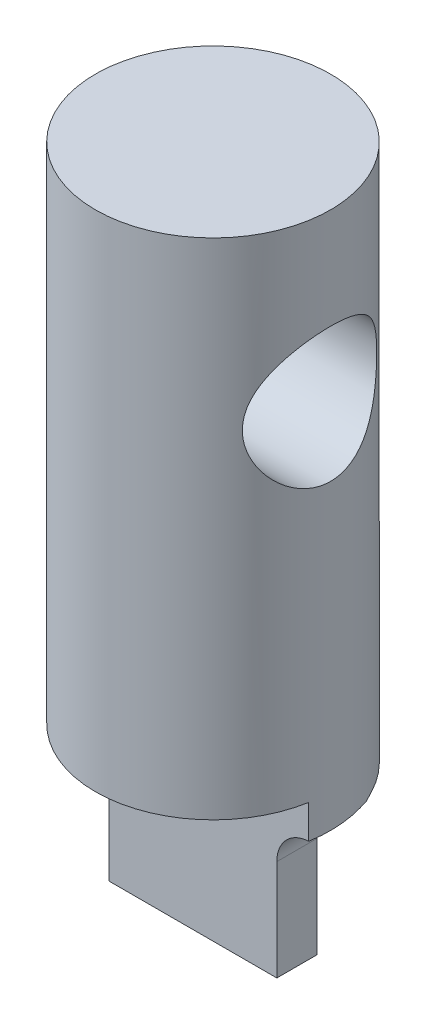
ISO-10303-21;
HEADER;
FILE_DESCRIPTION(('STEP AP214'),'2;1');
FILE_NAME('part.step','',(''),(''),'','','');
FILE_SCHEMA(('AUTOMOTIVE_DESIGN { 1 0 10303 214 1 1 1 1 }'));
ENDSEC;
DATA;
#1=APPLICATION_CONTEXT('core data for automotive mechanical design processes');
#2=APPLICATION_PROTOCOL_DEFINITION('international standard','automotive_design',2000,#1);
#3=PRODUCT_CONTEXT('',#1,'mechanical');
#4=PRODUCT('Part','Part','',(#3));
#5=PRODUCT_RELATED_PRODUCT_CATEGORY('part','',(#4));
#6=PRODUCT_DEFINITION_FORMATION('','',#4);
#7=PRODUCT_DEFINITION_CONTEXT('part definition',#1,'design');
#8=PRODUCT_DEFINITION('design','',#6,#7);
#9=PRODUCT_DEFINITION_SHAPE('','',#8);
#10=(LENGTH_UNIT() NAMED_UNIT(*) SI_UNIT(.MILLI.,.METRE.));
#11=(NAMED_UNIT(*) PLANE_ANGLE_UNIT() SI_UNIT($,.RADIAN.));
#12=(NAMED_UNIT(*) SI_UNIT($,.STERADIAN.) SOLID_ANGLE_UNIT());
#13=UNCERTAINTY_MEASURE_WITH_UNIT(LENGTH_MEASURE(1.E-05),#10,'distance_accuracy_value','');
#14=(GEOMETRIC_REPRESENTATION_CONTEXT(3) GLOBAL_UNCERTAINTY_ASSIGNED_CONTEXT((#13)) GLOBAL_UNIT_ASSIGNED_CONTEXT((#10,
#11,#12)) REPRESENTATION_CONTEXT('',''));
#15=CARTESIAN_POINT('',(0.,0.,0.));
#16=DIRECTION('',(0.,0.,1.));
#17=DIRECTION('',(1.,0.,0.));
#18=AXIS2_PLACEMENT_3D('',#15,#16,#17);
#19=CARTESIAN_POINT('',(0.,20.,0.));
#20=DIRECTION('',(0.,1.,0.));
#21=DIRECTION('',(0.,0.,1.));
#22=AXIS2_PLACEMENT_3D('',#19,#20,#21);
#23=CYLINDRICAL_SURFACE('',#22,17.5);
#24=CARTESIAN_POINT('',(17.5,85.,0.));
#25=CARTESIAN_POINT('',(17.4999979868255,84.9999977806547,0.257935712475636));
#26=CARTESIAN_POINT('',(17.4942823940968,84.9900046194406,0.515951338248237));
#27=CARTESIAN_POINT('',(17.4715560704947,84.9501523388648,1.0300566002893));
#28=CARTESIAN_POINT('',(17.454538277903,84.9202807992864,1.28614493113263));
#29=CARTESIAN_POINT('',(17.4095881860535,84.8409771085639,1.79487538192351));
#30=CARTESIAN_POINT('',(17.3816323703243,84.7915028090595,2.04750885462536));
#31=CARTESIAN_POINT('',(17.3154981674919,84.6736164445406,2.54695873651591));
#32=CARTESIAN_POINT('',(17.2773188162456,84.6052025933877,2.79377459467753));
#33=CARTESIAN_POINT('',(17.1918577616143,84.450613686155,3.27877572809726));
#34=CARTESIAN_POINT('',(17.144621475626,84.3645271065117,3.51699730104857));
#35=CARTESIAN_POINT('',(17.0419860913522,84.1752716232026,3.98472670495858));
#36=CARTESIAN_POINT('',(16.9865867222853,84.072102152858,4.21423424654229));
#37=CARTESIAN_POINT('',(16.868840115135,83.8496702576019,4.66326955139893));
#38=CARTESIAN_POINT('',(16.8064968295679,83.7304169796137,4.88280289285636));
#39=CARTESIAN_POINT('',(16.6760808290629,83.4766457176227,5.31116558590711));
#40=CARTESIAN_POINT('',(16.6080061516022,83.342122499406,5.51999123130319));
#41=CARTESIAN_POINT('',(16.4624214775571,83.048523075978,5.94068301449753));
#42=CARTESIAN_POINT('',(16.3845849809269,82.88837724373,6.15168976883497));
#43=CARTESIAN_POINT('',(16.2255446000953,82.5524955067285,6.55970074227494));
#44=CARTESIAN_POINT('',(16.1443392259096,82.3767526637387,6.75669865873048));
#45=CARTESIAN_POINT('',(15.9802883044577,82.0104532494262,7.13604426947621));
#46=CARTESIAN_POINT('',(15.8974413271866,81.8198832975537,7.3183784217174));
#47=CARTESIAN_POINT('',(15.7320326353485,81.4248750296747,7.66749415393978));
#48=CARTESIAN_POINT('',(15.6494709297596,81.2204362812892,7.83427524864763));
#49=CARTESIAN_POINT('',(15.477703535529,80.7754563318141,8.16883023298701));
#50=CARTESIAN_POINT('',(15.3887526871419,80.5334075015613,8.33473667294528));
#51=CARTESIAN_POINT('',(15.2163760585006,80.0341799965284,8.64543100792296));
#52=CARTESIAN_POINT('',(15.1329510640381,79.7769991797148,8.79021590290503));
#53=CARTESIAN_POINT('',(14.9746807796734,79.2490462074714,9.0572070153137));
#54=CARTESIAN_POINT('',(14.8998250091883,78.9782912498041,9.17944092812885));
#55=CARTESIAN_POINT('',(14.7616074345714,78.4244497741898,9.4001022679361));
#56=CARTESIAN_POINT('',(14.6982418613251,78.1413673379349,9.49853750512095));
#57=CARTESIAN_POINT('',(14.5983423427393,77.6287055280102,9.65115372904453));
#58=CARTESIAN_POINT('',(14.5589737816985,77.401148193056,9.71030743190504));
#59=CARTESIAN_POINT('',(14.4901968197609,76.9410071037895,9.81264540287861));
#60=CARTESIAN_POINT('',(14.4607864301503,76.7084243629662,9.85583285971697));
#61=CARTESIAN_POINT('',(14.4129467127035,76.2398744114409,9.92566188622712));
#62=CARTESIAN_POINT('',(14.3945076446673,76.0039103937924,9.95231813298911));
#63=CARTESIAN_POINT('',(14.3692375602479,75.5300512075554,9.98876914442462));
#64=CARTESIAN_POINT('',(14.362406775435,75.2921560005371,9.99856357272649));
#65=CARTESIAN_POINT('',(14.3606097259068,74.8159043494184,10.001144501773));
#66=CARTESIAN_POINT('',(14.3656596011975,74.5775477179156,9.99390786562675));
#67=CARTESIAN_POINT('',(14.3874667242791,74.1025002097456,9.96248776401509));
#68=CARTESIAN_POINT('',(14.4042240183591,73.8658093396683,9.93830423154453));
#69=CARTESIAN_POINT('',(14.4488449764179,73.3956526468184,9.87331886132434));
#70=CARTESIAN_POINT('',(14.4767151160874,73.1621887867094,9.83250733378678));
#71=CARTESIAN_POINT('',(14.5425965699819,72.7001245734982,9.73480084264666));
#72=CARTESIAN_POINT('',(14.5806081275568,72.471524337244,9.67790549310067));
#73=CARTESIAN_POINT('',(14.6653837056209,72.0213857695125,9.54894973269151));
#74=CARTESIAN_POINT('',(14.712110458863,71.7998219033615,9.47695373657523));
#75=CARTESIAN_POINT('',(14.8130846815472,71.3637208193821,9.31833428783118));
#76=CARTESIAN_POINT('',(14.8673347354085,71.1491860476455,9.23170580638368));
#77=CARTESIAN_POINT('',(15.0392492979227,70.5174659690542,8.95093131299783));
#78=CARTESIAN_POINT('',(15.1661231060327,70.1119393619861,8.73583079291443));
#79=CARTESIAN_POINT('',(15.4546711926498,69.2750229500435,8.21612488323257));
#80=CARTESIAN_POINT('',(15.6186641110564,68.8499026612341,7.90270010447165));
#81=CARTESIAN_POINT('',(15.8660772642798,68.253515886083,7.38608766540814));
#82=CARTESIAN_POINT('',(15.9488477258696,68.0614750951189,7.20598629951527));
#83=CARTESIAN_POINT('',(16.1130920084403,67.6918417985275,6.83082318334465));
#84=CARTESIAN_POINT('',(16.1945656177635,67.5142516323105,6.63575902063181));
#85=CARTESIAN_POINT('',(16.3635383796171,67.1550461535497,6.20832453422435));
#86=CARTESIAN_POINT('',(16.4506617686405,66.9752911005536,5.97423857173732));
#87=CARTESIAN_POINT('',(16.6186465162681,66.636324279654,5.48965472766126));
#88=CARTESIAN_POINT('',(16.6995103987039,66.4771042146166,5.23916353665728));
#89=CARTESIAN_POINT('',(16.8527441092134,66.1806415322799,4.72307604325323));
#90=CARTESIAN_POINT('',(16.9251157571672,66.0433942039326,4.45748299534881));
#91=CARTESIAN_POINT('',(17.0592582821866,65.7924190858084,3.91284084323328));
#92=CARTESIAN_POINT('',(17.1210304736491,65.6786883794685,3.63379341295261));
#93=CARTESIAN_POINT('',(17.2282281061223,65.4832756298085,3.08400643489189));
#94=CARTESIAN_POINT('',(17.2744877593832,65.3999228980344,2.81402367137461));
#95=CARTESIAN_POINT('',(17.3548466440517,65.2560650769391,2.26625179135742));
#96=CARTESIAN_POINT('',(17.3889463179324,65.1955591562713,1.98846295929888));
#97=CARTESIAN_POINT('',(17.4439389870897,65.0983529856142,1.42769004995767));
#98=CARTESIAN_POINT('',(17.4648428266057,65.0616331877137,1.14471043575959));
#99=CARTESIAN_POINT('',(17.4928348330458,65.0125236091901,0.575979150248226));
#100=CARTESIAN_POINT('',(17.4999245464831,65.0001311050869,0.29022779283598));
#101=CARTESIAN_POINT('',(17.5000652083574,64.9998867099822,-0.246547559789149));
#102=CARTESIAN_POINT('',(17.4947162116065,65.0092378150911,-0.497575398795089));
#103=CARTESIAN_POINT('',(17.4733266127457,65.0467400488142,-0.997744312031972));
#104=CARTESIAN_POINT('',(17.4572870564109,65.0748893385478,-1.24688556840204));
#105=CARTESIAN_POINT('',(17.4149031130774,65.149629701252,-1.74148402033753));
#106=CARTESIAN_POINT('',(17.3885587853426,65.1962206681627,-1.98694123708183));
#107=CARTESIAN_POINT('',(17.3261821915081,65.3072862859166,-2.47251600687362));
#108=CARTESIAN_POINT('',(17.2901496323308,65.3717614777757,-2.71263339814865));
#109=CARTESIAN_POINT('',(17.2096359442408,65.5171107349749,-3.18353496562945));
#110=CARTESIAN_POINT('',(17.1652479507959,65.5978046303304,-3.4143908781331));
#111=CARTESIAN_POINT('',(17.0686990105672,65.7752491746352,-3.86825118766334));
#112=CARTESIAN_POINT('',(17.0165353164057,65.8720055002802,-4.09125277496241));
#113=CARTESIAN_POINT('',(16.9055021620532,66.0807058758467,-4.52822362056264));
#114=CARTESIAN_POINT('',(16.8466340906442,66.1926467812642,-4.74219473694522));
#115=CARTESIAN_POINT('',(16.7232867272426,66.4309443918473,-5.16035121316149));
#116=CARTESIAN_POINT('',(16.6588054152814,66.5573062916503,-5.36453300890037));
#117=CARTESIAN_POINT('',(16.5185098823631,66.8374416956853,-5.78294300635533));
#118=CARTESIAN_POINT('',(16.4422138637069,66.9926989342183,-5.99601710808323));
#119=CARTESIAN_POINT('',(16.2858700875011,67.3188505648056,-6.40851919530944));
#120=CARTESIAN_POINT('',(16.2058206395343,67.4897520361355,-6.60794093082768));
#121=CARTESIAN_POINT('',(16.0436525094802,67.8463972278207,-6.99248118179562));
#122=CARTESIAN_POINT('',(15.961532092253,68.0321536976337,-7.17758713668908));
#123=CARTESIAN_POINT('',(15.797088150234,68.4175710392385,-7.53261477539148));
#124=CARTESIAN_POINT('',(15.7147646174194,68.6172324690314,-7.7025358492111));
#125=CARTESIAN_POINT('',(15.542691494459,69.0527630209848,-8.0445859738455));
#126=CARTESIAN_POINT('',(15.4531392137275,69.2901856501746,-8.21484268320355));
#127=CARTESIAN_POINT('',(15.2788309152998,69.7803135375681,-8.53466513032912));
#128=CARTESIAN_POINT('',(15.1940755859622,70.0330209784204,-8.68422790296005));
#129=CARTESIAN_POINT('',(15.032342741009,70.5522902337263,-8.96127110203343));
#130=CARTESIAN_POINT('',(14.955356941844,70.8188368241255,-9.08877515244744));
#131=CARTESIAN_POINT('',(14.8120530436713,71.3645976070458,-9.32049704240887));
#132=CARTESIAN_POINT('',(14.7457316682584,71.6438078750076,-9.42472203776731));
#133=CARTESIAN_POINT('',(14.6393800853736,72.1522978564172,-9.58884562434214));
#134=CARTESIAN_POINT('',(14.5967594105274,72.3795237834309,-9.65345712287691));
#135=CARTESIAN_POINT('',(14.5212384075228,72.8394933757716,-9.76669228660932));
#136=CARTESIAN_POINT('',(14.4883361324869,73.0722359258534,-9.81531915421291));
#137=CARTESIAN_POINT('',(14.4333839780158,73.5416314394956,-9.89594934469037));
#138=CARTESIAN_POINT('',(14.4113239132863,73.7782805163311,-9.92796827082279));
#139=CARTESIAN_POINT('',(14.3788071767777,74.254069066164,-9.97500517121269));
#140=CARTESIAN_POINT('',(14.3683506843277,74.4932085775926,-9.99002288272247));
#141=CARTESIAN_POINT('',(14.3594284808409,74.9726603684899,-10.002843451218));
#142=CARTESIAN_POINT('',(14.3609870961808,75.2129740422293,-10.0006113834313));
#143=CARTESIAN_POINT('',(14.3760929173373,75.6924361882737,-9.97888391336079));
#144=CARTESIAN_POINT('',(14.3896401674682,75.9315846562685,-9.95938844726523));
#145=CARTESIAN_POINT('',(14.4282238946407,76.4070664788909,-9.90340870948359));
#146=CARTESIAN_POINT('',(14.4532665756506,76.6433982426208,-9.86691526400265));
#147=CARTESIAN_POINT('',(14.5139460312704,77.1115193607545,-9.7774374561138));
#148=CARTESIAN_POINT('',(14.5495829911275,77.3433086356545,-9.72445280534661));
#149=CARTESIAN_POINT('',(14.6295585028424,77.7969553394423,-9.60370550533511));
#150=CARTESIAN_POINT('',(14.6737325474651,78.0189158265655,-9.53621989683348));
#151=CARTESIAN_POINT('',(14.7698820808678,78.4561472934323,-9.38661175219194));
#152=CARTESIAN_POINT('',(14.8218602388912,78.6714159538423,-9.3044842062569));
#153=CARTESIAN_POINT('',(14.987436035345,79.3057788217927,-9.03718626104024));
#154=CARTESIAN_POINT('',(15.110718977254,79.7136655009989,-8.83103697232192));
#155=CARTESIAN_POINT('',(15.3922047922842,80.5543283256767,-8.33209861894715));
#156=CARTESIAN_POINT('',(15.5528615991746,80.9812654161028,-8.03085638880198));
#157=CARTESIAN_POINT('',(15.7967817610628,81.5819244329351,-7.53299810501225));
#158=CARTESIAN_POINT('',(15.8786395436795,81.7756487740726,-7.35923330017833));
#159=CARTESIAN_POINT('',(16.0415995913775,82.1492090867596,-6.99689199696128));
#160=CARTESIAN_POINT('',(16.1227017351745,82.3290428614468,-6.80831316513962));
#161=CARTESIAN_POINT('',(16.2923489863849,82.6954664095683,-6.39264072319441));
#162=CARTESIAN_POINT('',(16.3805589394026,82.8800958306143,-6.16367817171239));
#163=CARTESIAN_POINT('',(16.5513716096548,83.2292818635184,-5.68908312387619));
#164=CARTESIAN_POINT('',(16.6339763486566,83.3938457301545,-5.44345670269834));
#165=CARTESIAN_POINT('',(16.7913352454167,83.701517827465,-4.9367429512859));
#166=CARTESIAN_POINT('',(16.8660901685794,83.8446281505724,-4.67565713232548));
#167=CARTESIAN_POINT('',(17.0055939659873,84.1078364743017,-4.13961449822452));
#168=CARTESIAN_POINT('',(17.0703455960059,84.227940814959,-3.86466153108379));
#169=CARTESIAN_POINT('',(17.1774365898285,84.4244276678306,-3.35281738556435));
#170=CARTESIAN_POINT('',(17.2217138747987,84.5047870766266,-3.11785055824598));
#171=CARTESIAN_POINT('',(17.3012266461431,84.6481088456461,-2.64119257414697));
#172=CARTESIAN_POINT('',(17.3364637315297,84.711074282632,-2.39950261493485));
#173=CARTESIAN_POINT('',(17.397023949342,84.8187789296656,-1.91151047112828));
#174=CARTESIAN_POINT('',(17.4223712781558,84.8635626343764,-1.66522110790907));
#175=CARTESIAN_POINT('',(17.462666418354,84.9345649305685,-1.16923562660988));
#176=CARTESIAN_POINT('',(17.4776201461088,84.9607940840456,-0.919541529290495));
#177=CARTESIAN_POINT('',(17.4914638950011,84.9850556710816,-0.557783649106459));
#178=CARTESIAN_POINT('',(17.4946628042429,84.9906574535729,-0.44633611313507));
#179=CARTESIAN_POINT('',(17.498931404094,84.9981302940031,-0.223264053117576));
#180=CARTESIAN_POINT('',(17.5000008713404,85.0000009605751,-0.111639511733758));
#181=CARTESIAN_POINT('',(17.5,85.,0.));
#182=B_SPLINE_CURVE_WITH_KNOTS('',3,(#24,#25,#26,#27,#28,#29,#30,#31,#32,#33,#34,#35,#36,#37,
#38,#39,#40,#41,#42,#43,#44,#45,#46,#47,#48,#49,#50,#51,#52,#53,#54,#55,#56,#57,#58,#59,#60,#61,
#62,#63,#64,#65,#66,#67,#68,#69,#70,#71,#72,#73,#74,#75,#76,#77,#78,#79,#80,#81,#82,#83,#84,#85,
#86,#87,#88,#89,#90,#91,#92,#93,#94,#95,#96,#97,#98,#99,#100,#101,#102,#103,#104,#105,#106,#107,
#108,#109,#110,#111,#112,#113,#114,#115,#116,#117,#118,#119,#120,#121,#122,#123,#124,#125,#126,
#127,#128,#129,#130,#131,#132,#133,#134,#135,#136,#137,#138,#139,#140,#141,#142,#143,#144,#145,
#146,#147,#148,#149,#150,#151,#152,#153,#154,#155,#156,#157,#158,#159,#160,#161,#162,#163,#164,
#165,#166,#167,#168,#169,#170,#171,#172,#173,#174,#175,#176,#177,#178,#179,#180,#181),
.UNSPECIFIED.,.T.,.F.,(4,2,2,2,2,2,2,2,2,2,2,2,2,2,2,2,2,2,2,2,2,2,2,2,2,2,2,2,2,2,2,2,2,2,2,2,
2,2,2,2,2,2,2,2,2,2,2,2,2,2,2,2,2,2,2,2,2,2,2,2,2,2,2,2,2,2,2,2,2,2,2,2,2,2,2,2,2,2,4),(0.,
0.773690810059207,1.5478654845956,2.32371384289975,3.09963539432407,3.87176318506903,
4.64391659419774,5.41563271393325,6.18761416509908,7.01505666148934,7.84286910354637,
8.67143745885687,9.50003165781306,10.4188051765691,11.3377090682101,12.2554768087965,
13.1729429484643,13.8873907663071,14.601695819838,15.3153657725343,16.0290499618667,
16.7437042586717,17.4583613811125,18.1734355594276,18.8885268979439,19.6006277514276,
20.3129738359954,21.7369557635231,23.3891327768375,24.2164532980279,25.0439074886907,
25.9659444178928,26.8876076243463,27.8090729568853,28.7304239394265,29.5881564714937,
30.4458577895045,31.3028533341447,32.1597529312667,32.9126084534985,33.6653903404896,
34.4181678982141,35.1709682306988,35.9158271292594,36.6609498343603,37.4059184703619,
38.151156306226,38.9736800248734,39.7965778067163,40.6201895892654,41.443834442127,
42.3594547561286,43.2752061294839,44.1899706171586,45.1044535247476,45.8238669858532,
46.5431362296747,47.2617284862017,47.9803318481637,48.7003905112968,49.4204518360379,
50.140902228347,50.8613652188995,51.5691248843009,52.2771271787718,53.6923953278759,
55.3255949952952,56.1434108027377,56.9613556881255,57.8814354816136,58.8011816240783,
59.7208380023057,60.640240573983,61.3961780963896,62.1519818177527,62.9059246088702,
63.6594378793675,63.9942709461532,64.3291391326439),.UNSPECIFIED.);
#183=CARTESIAN_POINT('',(17.5,85.,0.));
#184=VERTEX_POINT('',#183);
#185=EDGE_CURVE('E13',#184,#184,#182,.T.);
#186=ORIENTED_EDGE('',*,*,#185,.F.);
#187=EDGE_LOOP('',(#186));
#188=FACE_BOUND('',#187,.T.);
#189=CARTESIAN_POINT('',(-14.3614066163451,75.,9.99999999999998));
#190=CARTESIAN_POINT('',(-14.3614077608894,75.2544150778964,9.99999919069356));
#191=CARTESIAN_POINT('',(-14.3681922719696,75.5088415935461,9.99027614949745));
#192=CARTESIAN_POINT('',(-14.3950423523035,76.0155159825121,9.95154758812697));
#193=CARTESIAN_POINT('',(-14.415108832493,76.2677637051951,9.9225407453842));
#194=CARTESIAN_POINT('',(-14.4677146656621,76.7682687890077,9.84567886986767));
#195=CARTESIAN_POINT('',(-14.5002653124784,77.0165223242806,9.79780676950381));
#196=CARTESIAN_POINT('',(-14.5765752445555,77.5070444956747,9.68391141001014));
#197=CARTESIAN_POINT('',(-14.6203347003789,77.7493130406617,9.61788787467186));
#198=CARTESIAN_POINT('',(-14.7171872327601,78.2248141336555,9.46901358628469));
#199=CARTESIAN_POINT('',(-14.770214911942,78.4580968691713,9.38628014221345));
#200=CARTESIAN_POINT('',(-14.8841534872825,78.9162888805885,9.20453573141224));
#201=CARTESIAN_POINT('',(-14.9450674947102,79.1411948063852,9.10551833624238));
#202=CARTESIAN_POINT('',(-15.1370442315329,79.8018325165531,8.78531736753681));
#203=CARTESIAN_POINT('',(-15.2774091100172,80.2237961753715,8.54088602881865));
#204=CARTESIAN_POINT('',(-15.5856817333625,81.0692168531832,7.96580072474524));
#205=CARTESIAN_POINT('',(-15.754921507378,81.4877524958655,7.62862705436988));
#206=CARTESIAN_POINT('',(-16.0069975072251,82.071396219298,7.0758266986282));
#207=CARTESIAN_POINT('',(-16.0907907826785,82.2587141135651,6.88355010578419));
#208=CARTESIAN_POINT('',(-16.2559061769366,82.6177372165059,6.48399252010687));
#209=CARTESIAN_POINT('',(-16.3372291502715,82.7894478659675,6.27671680167737));
#210=CARTESIAN_POINT('',(-16.5031207260465,83.1318826530205,5.82749300882114));
#211=CARTESIAN_POINT('',(-16.5872602103054,83.3009537134546,5.58412309411241));
#212=CARTESIAN_POINT('',(-16.7480716001117,83.6178035373285,5.08150642726078));
#213=CARTESIAN_POINT('',(-16.824742907344,83.7655805952474,4.82225840574457));
#214=CARTESIAN_POINT('',(-16.9683669740937,84.0381907882567,4.28958688551924));
#215=CARTESIAN_POINT('',(-17.0353258457576,84.1630383664151,4.01617245023952));
#216=CARTESIAN_POINT('',(-17.1575464231836,84.3883096707867,3.45694510627656));
#217=CARTESIAN_POINT('',(-17.212809835191,84.4887369599834,3.17113401347699));
#218=CARTESIAN_POINT('',(-17.3055793736332,84.6559551687691,2.61518447412809));
#219=CARTESIAN_POINT('',(-17.3442232404225,84.7249344611497,2.34589342332863));
#220=CARTESIAN_POINT('',(-17.4092329510793,84.8404103416859,1.80106724064426));
#221=CARTESIAN_POINT('',(-17.4355994561433,84.8869081405862,1.52553244585411));
#222=CARTESIAN_POINT('',(-17.4752633201811,84.9566888044523,0.970796928031442));
#223=CARTESIAN_POINT('',(-17.4885697419977,84.979987768054,0.691598883586094));
#224=CARTESIAN_POINT('',(-17.5017404594881,85.0030502390967,0.131925255874034));
#225=CARTESIAN_POINT('',(-17.5016059411759,85.0028158230978,-0.148550212490261));
#226=CARTESIAN_POINT('',(-17.4886820148289,84.9801833588368,-0.676517685224887));
#227=CARTESIAN_POINT('',(-17.4773236133062,84.9602915443433,-0.924157139451819));
#228=CARTESIAN_POINT('',(-17.4443169317774,84.9022606169359,-1.41657386655287));
#229=CARTESIAN_POINT('',(-17.42266960824,84.8641232001496,-1.66135140330706));
#230=CARTESIAN_POINT('',(-17.3695878573906,84.7700607540258,-2.14638026543599));
#231=CARTESIAN_POINT('',(-17.3381531051595,84.7141351341613,-2.38663144026556));
#232=CARTESIAN_POINT('',(-17.2662028794279,84.5851252948763,-2.86108681557573));
#233=CARTESIAN_POINT('',(-17.2256870431072,84.5120403898783,-3.09529077403241));
#234=CARTESIAN_POINT('',(-17.1360628827446,84.348761774596,-3.55829068383476));
#235=CARTESIAN_POINT('',(-17.0868836483026,84.2584263107434,-3.78702279078187));
#236=CARTESIAN_POINT('',(-16.9811810955382,84.061863954148,-4.23587971533365));
#237=CARTESIAN_POINT('',(-16.9246551526388,83.955631380175,-4.4560014201761));
#238=CARTESIAN_POINT('',(-16.8054031898753,83.7281701275851,-4.88654449828843));
#239=CARTESIAN_POINT('',(-16.7426781159623,83.6069437362293,-5.09696734438377));
#240=CARTESIAN_POINT('',(-16.6121898739968,83.3502735657932,-5.5074082329513));
#241=CARTESIAN_POINT('',(-16.5444249003378,83.2148246841023,-5.70742250237706));
#242=CARTESIAN_POINT('',(-16.3972493582156,82.9144685468562,-6.11825460127685));
#243=CARTESIAN_POINT('',(-16.3173877336959,82.747961919088,-6.32774295707801));
#244=CARTESIAN_POINT('',(-16.1547638285188,82.3993357632984,-6.73209520895978));
#245=CARTESIAN_POINT('',(-16.072001332889,82.2172150767258,-6.92695801782067));
#246=CARTESIAN_POINT('',(-15.9053349411175,81.8380343063179,-7.30153328910701));
#247=CARTESIAN_POINT('',(-15.8214298369941,81.6409572093403,-7.48122799175692));
#248=CARTESIAN_POINT('',(-15.654517047834,81.2328624373881,-7.82448230550949));
#249=CARTESIAN_POINT('',(-15.5715093800881,81.021844494374,-7.98804160622717));
#250=CARTESIAN_POINT('',(-15.4002867357296,80.5648962111023,-8.31374204680292));
#251=CARTESIAN_POINT('',(-15.3123789637889,80.3175834460344,-8.47411219404252));
#252=CARTESIAN_POINT('',(-15.1429756677386,79.8080585446329,-8.77324627838107));
#253=CARTESIAN_POINT('',(-15.061481033386,79.5458443495392,-8.91200722002965));
#254=CARTESIAN_POINT('',(-14.9080345094828,79.0082109483358,-9.16638148488004));
#255=CARTESIAN_POINT('',(-14.8360688084758,78.7328116597114,-9.28202843678565));
#256=CARTESIAN_POINT('',(-14.7045975812725,78.1701566010127,-9.48893395841661));
#257=CARTESIAN_POINT('',(-14.6450877003048,77.8829050168962,-9.58020105485709));
#258=CARTESIAN_POINT('',(-14.553251905705,77.3656507039398,-9.71895529180451));
#259=CARTESIAN_POINT('',(-14.5178216129494,77.1375921252812,-9.77168164642523));
#260=CARTESIAN_POINT('',(-14.4571918965724,76.6770386382915,-9.86116308246928));
#261=CARTESIAN_POINT('',(-14.4319904668805,76.4445446092084,-9.89792129564183));
#262=CARTESIAN_POINT('',(-14.3927017861997,75.9767945921072,-9.95496556010652));
#263=CARTESIAN_POINT('',(-14.3786057143886,75.7415409470651,-9.97526468498476));
#264=CARTESIAN_POINT('',(-14.3620056681943,75.2697664367658,-9.99915038467961));
#265=CARTESIAN_POINT('',(-14.3595019892031,75.0332455393707,-10.0027365336238));
#266=CARTESIAN_POINT('',(-14.3661830056139,74.5605790767916,-9.99313858043444));
#267=CARTESIAN_POINT('',(-14.3753742789411,74.3244337977014,-9.97994504042427));
#268=CARTESIAN_POINT('',(-14.4051171321618,73.8543891511197,-9.93696521564553));
#269=CARTESIAN_POINT('',(-14.425668754265,73.6204897919762,-9.90717886922589));
#270=CARTESIAN_POINT('',(-14.4774141374652,73.1564370365846,-9.83140768977235));
#271=CARTESIAN_POINT('',(-14.5086124195691,72.9262852752909,-9.78541597500637));
#272=CARTESIAN_POINT('',(-14.5806265632807,72.4711258220958,-9.67778456882104));
#273=CARTESIAN_POINT('',(-14.6214463036466,72.2461202450452,-9.6161385658139));
#274=CARTESIAN_POINT('',(-14.7119947751798,71.7998246077606,-9.47703391214448));
#275=CARTESIAN_POINT('',(-14.7618248580549,71.5786119049954,-9.3993938049147));
#276=CARTESIAN_POINT('',(-14.8686663500159,71.1436130750627,-9.22945454301334));
#277=CARTESIAN_POINT('',(-14.9256801266721,70.929829426102,-9.13715055285522));
#278=CARTESIAN_POINT('',(-15.0454393305122,70.5104975942096,-8.93857898932572));
#279=CARTESIAN_POINT('',(-15.1081853977035,70.3049503345616,-8.83230985617061));
#280=CARTESIAN_POINT('',(-15.2379767647689,69.9027282864117,-8.6064527722627));
#281=CARTESIAN_POINT('',(-15.3050223162533,69.7060540183159,-8.48686404173099));
#282=CARTESIAN_POINT('',(-15.4534292508155,69.2901632248009,-8.21398093816703));
#283=CARTESIAN_POINT('',(-15.5353169011545,69.0726385050098,-8.05838882684503));
#284=CARTESIAN_POINT('',(-15.7009619680746,68.6511602259812,-7.73068595303427));
#285=CARTESIAN_POINT('',(-15.7847195397912,68.4472077983798,-7.55857381604681));
#286=CARTESIAN_POINT('',(-15.9521698615337,68.0535274480709,-7.19845336222198));
#287=CARTESIAN_POINT('',(-16.0358625234412,67.8638097175264,-7.01043385669449));
#288=CARTESIAN_POINT('',(-16.2012298285532,67.4995881047403,-6.61930849940368));
#289=CARTESIAN_POINT('',(-16.2829041360653,67.3250867412402,-6.41620016027507));
#290=CARTESIAN_POINT('',(-16.450398930495,66.9755710547075,-5.9745776650814));
#291=CARTESIAN_POINT('',(-16.5358137283182,66.8022604994141,-5.73455555014515));
#292=CARTESIAN_POINT('',(-16.699594610513,66.4767237583408,-5.23848562224432));
#293=CARTESIAN_POINT('',(-16.777963706055,66.3244885502821,-4.98244473544082));
#294=CARTESIAN_POINT('',(-16.9254481636678,66.0425885018712,-4.45577693835577));
#295=CARTESIAN_POINT('',(-16.9945667416227,65.9129158130727,-4.18515514316424));
#296=CARTESIAN_POINT('',(-17.12150556908,65.6776738241043,-3.63108500813105));
#297=CARTESIAN_POINT('',(-17.1793273801446,65.5721011922217,-3.34763844774893));
#298=CARTESIAN_POINT('',(-17.2776698670346,65.3941209301706,-2.79368939215357));
#299=CARTESIAN_POINT('',(-17.3192157082664,65.3197132334525,-2.52401126302992));
#300=CARTESIAN_POINT('',(-17.3900556493052,65.193534390309,-1.97781967884862));
#301=CARTESIAN_POINT('',(-17.419350330324,65.1417621700204,-1.70130654871205));
#302=CARTESIAN_POINT('',(-17.4648009202012,65.0616722598088,-1.14403907205617));
#303=CARTESIAN_POINT('',(-17.4809665076933,65.0333372918977,-0.863288005507871));
#304=CARTESIAN_POINT('',(-17.4996977325409,65.0005195981582,-0.299952862726438));
#305=CARTESIAN_POINT('',(-17.5022646940462,64.9960345499727,-0.0173689676457669));
#306=CARTESIAN_POINT('',(-17.4942265500865,65.0101062918487,0.514028254832859));
#307=CARTESIAN_POINT('',(-17.4851217572307,65.0260385193786,0.762939007105641));
#308=CARTESIAN_POINT('',(-17.4564688165651,65.0763547947358,1.25826068022008));
#309=CARTESIAN_POINT('',(-17.4369216625523,65.1107370866762,1.50467183667407));
#310=CARTESIAN_POINT('',(-17.3878444150122,65.1975303245391,1.99328008678872));
#311=CARTESIAN_POINT('',(-17.358314137146,65.2499416033681,2.23547710254824));
#312=CARTESIAN_POINT('',(-17.2899444446051,65.3721889898146,2.71408623705684));
#313=CARTESIAN_POINT('',(-17.2511046896421,65.4420257343872,2.95049814399527));
#314=CARTESIAN_POINT('',(-17.1649078836734,65.598493221829,3.4164539272666));
#315=CARTESIAN_POINT('',(-17.1175393133858,65.6851466903625,3.64598801902621));
#316=CARTESIAN_POINT('',(-17.0152925810267,65.8744028506187,4.09673675204133));
#317=CARTESIAN_POINT('',(-16.9604117463201,65.9770112203838,4.31794839655485));
#318=CARTESIAN_POINT('',(-16.844255179484,66.1972908706361,4.75092661983317));
#319=CARTESIAN_POINT('',(-16.7829805605984,66.3149595297293,4.96269483369216));
#320=CARTESIAN_POINT('',(-16.6551721331801,66.5645832458654,5.37606449421936));
#321=CARTESIAN_POINT('',(-16.5886364367544,66.6965434376402,5.57766224840815));
#322=CARTESIAN_POINT('',(-16.4440306541835,66.9891293972967,5.99140949250493));
#323=CARTESIAN_POINT('',(-16.3654953701813,67.1513118071144,6.2022967676569));
#324=CARTESIAN_POINT('',(-16.2051702349587,67.4913362737931,6.60987486940665));
#325=CARTESIAN_POINT('',(-16.1233789021057,67.6691855053782,6.80655911581463));
#326=CARTESIAN_POINT('',(-15.9582986563081,68.0397671227049,7.18507999731651));
#327=CARTESIAN_POINT('',(-15.8750084195467,68.2325132155212,7.36690263356702));
#328=CARTESIAN_POINT('',(-15.708892251868,68.6319326803771,7.714782231815));
#329=CARTESIAN_POINT('',(-15.6260663338663,68.8386064377676,7.88083875728893));
#330=CARTESIAN_POINT('',(-15.4543008511851,69.2874872574214,8.2129836854585));
#331=CARTESIAN_POINT('',(-15.3656299473578,69.5311485179234,8.37725257996231));
#332=CARTESIAN_POINT('',(-15.1940787878725,70.033536538382,8.68452347137072));
#333=CARTESIAN_POINT('',(-15.1111993585125,70.2922654384967,8.82752243686215));
#334=CARTESIAN_POINT('',(-14.9543139401747,70.8231923636221,9.09076180317971));
#335=CARTESIAN_POINT('',(-14.8802961205299,71.0953717295707,9.21103267410067));
#336=CARTESIAN_POINT('',(-14.744046982117,71.6519250282109,9.42759108750232));
#337=CARTESIAN_POINT('',(-14.6818116666092,71.9362947855158,9.52388676610586));
#338=CARTESIAN_POINT('',(-14.5846511441135,72.4485386225044,9.67180781809598));
#339=CARTESIAN_POINT('',(-14.5467368881497,72.6743619823709,9.72861332812583));
#340=CARTESIAN_POINT('',(-14.4807802305186,73.130789979386,9.82652026759994));
#341=CARTESIAN_POINT('',(-14.4527358837617,73.3613936649669,9.86762479141606));
#342=CARTESIAN_POINT('',(-14.4074779397845,73.8257888879933,9.93358875847174));
#343=CARTESIAN_POINT('',(-14.390255854573,74.0595777798397,9.95846093347162));
#344=CARTESIAN_POINT('',(-14.3672192273733,74.5289077579944,9.99166756044024));
#345=CARTESIAN_POINT('',(-14.361405556665,74.764448976752,10.0000007492989));
#346=CARTESIAN_POINT('',(-14.3614066163451,75.,9.99999999999998));
#347=B_SPLINE_CURVE_WITH_KNOTS('',3,(#189,#190,#191,#192,#193,#194,#195,#196,#197,#198,#199,
#200,#201,#202,#203,#204,#205,#206,#207,#208,#209,#210,#211,#212,#213,#214,#215,#216,#217,#218,
#219,#220,#221,#222,#223,#224,#225,#226,#227,#228,#229,#230,#231,#232,#233,#234,#235,#236,#237,
#238,#239,#240,#241,#242,#243,#244,#245,#246,#247,#248,#249,#250,#251,#252,#253,#254,#255,#256,
#257,#258,#259,#260,#261,#262,#263,#264,#265,#266,#267,#268,#269,#270,#271,#272,#273,#274,#275,
#276,#277,#278,#279,#280,#281,#282,#283,#284,#285,#286,#287,#288,#289,#290,#291,#292,#293,#294,
#295,#296,#297,#298,#299,#300,#301,#302,#303,#304,#305,#306,#307,#308,#309,#310,#311,#312,#313,
#314,#315,#316,#317,#318,#319,#320,#321,#322,#323,#324,#325,#326,#327,#328,#329,#330,#331,#332,
#333,#334,#335,#336,#337,#338,#339,#340,#341,#342,#343,#344,#345,#346),.UNSPECIFIED.,.T.,.F.,(4,
2,2,2,2,2,2,2,2,2,2,2,2,2,2,2,2,2,2,2,2,2,2,2,2,2,2,2,2,2,2,2,2,2,2,2,2,2,2,2,2,2,2,2,2,2,2,2,2,
2,2,2,2,2,2,2,2,2,2,2,2,2,2,2,2,2,2,2,2,2,2,2,2,2,2,2,2,2,4),(0.,0.762992657629241,
1.52603765006883,2.28977456778247,3.05352310784382,3.81208544137623,4.57094795573207,
6.0876812429021,7.77092084038625,8.6138680344238,9.45652023536651,10.3794664681519,
11.3024865823162,12.2249232855309,13.147225321973,13.9880125363162,14.8287544648712,
15.6689125601979,16.5089965209402,17.2541982583488,17.9993307345879,18.7444879500696,
19.4896749424274,20.241271633666,20.9931375711062,21.7448889548182,22.4969109723281,
23.3338304035295,24.1708119873433,25.0087603478477,25.8467248242125,26.7683280679481,
27.6900589500719,28.6104388781427,29.5304964858824,30.2399800941266,30.9493244921192,
31.6581048986721,32.3669033659451,33.0761006792224,33.7853006275602,34.4948021067024,
35.2045901022652,35.9229243709716,36.6414960074529,37.3601479703921,38.0788420280351,
38.9170787157777,39.7553852070197,40.5942863155089,41.4333260234229,42.3565145577852,
43.2793066482582,44.2017770979312,45.124119943323,45.9713866529979,46.8186131626231,
47.6652145371505,48.5117334733805,49.2595921384478,50.0073796426608,50.755180955561,
51.5030096069291,52.2518559807028,53.0009694670299,53.7499527395396,54.49920600879,
55.3305119287854,56.1622005498791,56.9946637594769,57.8271500111482,58.7468579193017,
59.6666967798779,60.5852935846543,61.503578231988,62.2106380673939,62.9175584824939,
63.6239237596527,64.3303429810338),.UNSPECIFIED.);
#348=CARTESIAN_POINT('',(-14.3614066163451,75.,9.99999999999998));
#349=VERTEX_POINT('',#348);
#350=EDGE_CURVE('E54',#349,#349,#347,.T.);
#351=ORIENTED_EDGE('',*,*,#350,.F.);
#352=EDGE_LOOP('',(#351));
#353=FACE_BOUND('',#352,.T.);
#354=CARTESIAN_POINT('',(17.2409396495667,19.9932842633715,2.99999999999999));
#355=CARTESIAN_POINT('',(17.2840143204635,19.9954820364495,2.75247254014912));
#356=CARTESIAN_POINT('',(17.3217517788505,19.9969167954232,2.50401252394365));
#357=CARTESIAN_POINT('',(17.3864966262818,19.998826348768,2.00569840346571));
#358=CARTESIAN_POINT('',(17.413504190162,19.9993011587813,1.75584432197579));
#359=CARTESIAN_POINT('',(17.4567332185332,19.9998568894878,1.25522576356962));
#360=CARTESIAN_POINT('',(17.4729555776018,19.9999378428531,1.00446136389482));
#361=CARTESIAN_POINT('',(17.4945890026253,20.0000094893127,0.502464656118375));
#362=CARTESIAN_POINT('',(17.4999999846227,20.0000001817062,0.251232344398244));
#363=CARTESIAN_POINT('',(17.5000000153783,19.9999998182824,-0.25124804558696));
#364=CARTESIAN_POINT('',(17.4945883877803,20.0000087636058,-0.502496123856118));
#365=CARTESIAN_POINT('',(17.4729522923547,19.9999385558875,-1.00452039334553));
#366=CARTESIAN_POINT('',(17.4567280651667,19.9998594048063,-1.25529659494308));
#367=CARTESIAN_POINT('',(17.4134980277193,19.9992984963844,-1.75590453274213));
#368=CARTESIAN_POINT('',(17.3864928279283,19.9988167618382,-2.00573632161218));
#369=CARTESIAN_POINT('',(17.3217495486297,19.9969262064855,-2.50402100347396));
#370=CARTESIAN_POINT('',(17.2840105147142,19.9955173032243,-2.75247377184522));
#371=CARTESIAN_POINT('',(17.1861270453554,19.990442464647,-3.31500544809772));
#372=CARTESIAN_POINT('',(17.1226792873595,19.9862659375901,-3.62851032033159));
#373=CARTESIAN_POINT('',(16.9787214371517,19.973278195803,-4.25149403425438));
#374=CARTESIAN_POINT('',(16.898212032429,19.9644671677961,-4.56097303763022));
#375=CARTESIAN_POINT('',(16.7648360023716,19.9458606418083,-5.02154251324962));
#376=CARTESIAN_POINT('',(16.7182324316501,19.9387521816983,-5.1745800737362));
#377=CARTESIAN_POINT('',(16.6208832511446,19.9223564418142,-5.47921575167172));
#378=CARTESIAN_POINT('',(16.5701377616163,19.913069225283,-5.63081391076938));
#379=CARTESIAN_POINT('',(16.4645499813063,19.8919064369534,-5.93246441922996));
#380=CARTESIAN_POINT('',(16.4097060750323,19.8800298409119,-6.08251613222053));
#381=CARTESIAN_POINT('',(16.2960232256336,19.8532287066314,-6.38084099644951));
#382=CARTESIAN_POINT('',(16.2371838374378,19.8383038284602,-6.5291139473734));
#383=CARTESIAN_POINT('',(16.1763948820264,19.8216251919529,-6.67639488202645));
#384=B_SPLINE_CURVE_WITH_KNOTS('',3,(#354,#355,#356,#357,#358,#359,#360,#361,#362,#363,#364,
#365,#366,#367,#368,#369,#370,#371,#372,#373,#374,#375,#376,#377,#378,#379,#380,#381,#382,#383),
.UNSPECIFIED.,.F.,.F.,(4,2,2,2,2,2,2,2,2,2,2,2,2,2,4),(0.,0.753707669792011,1.50740305795926,
2.26103592314459,3.01467464075876,3.76836045829454,4.52202950273914,5.27565587701659,
6.02934928158387,6.98851037899114,7.94763283489783,8.42797345695521,8.90830013786003,
9.38881716037855,9.86938779751268),.UNSPECIFIED.);
#385=CARTESIAN_POINT('',(17.2409396495667,19.9932842633715,3.));
#386=VERTEX_POINT('',#385);
#387=CARTESIAN_POINT('',(16.1763948820264,19.8216251919528,-6.67639488202644));
#388=VERTEX_POINT('',#387);
#389=EDGE_CURVE('E209',#386,#388,#384,.T.);
#390=ORIENTED_EDGE('',*,*,#389,.T.);
#391=CARTESIAN_POINT('',(16.1763948820264,19.8216251919528,-6.67639488202645));
#392=CARTESIAN_POINT('',(16.1308986643013,19.8518975692557,-6.78664825447527));
#393=CARTESIAN_POINT('',(16.0838846280337,19.8782126843348,-6.89734424950819));
#394=CARTESIAN_POINT('',(15.9871902656696,19.9229835239052,-7.11858083646531));
#395=CARTESIAN_POINT('',(15.9375221796976,19.94147232288,-7.22912007420149));
#396=CARTESIAN_POINT('',(15.8355006678799,19.9709006024726,-7.44994730512935));
#397=CARTESIAN_POINT('',(15.7831473946197,19.9818405115462,-7.56023531222605));
#398=CARTESIAN_POINT('',(15.6757171570039,19.9964079644714,-7.78055482012038));
#399=CARTESIAN_POINT('',(15.6206294774078,20.0000039560807,-7.89058319386272));
#400=CARTESIAN_POINT('',(15.5643824162734,20.,-7.99999999999999));
#401=B_SPLINE_CURVE_WITH_KNOTS('',3,(#391,#392,#393,#394,#395,#396,#397,#398,#399,#400),
.UNSPECIFIED.,.F.,.F.,(4,2,2,2,4),(0.,0.36906414462508,0.736552642213279,1.10402028037648,
1.47306340486284),.UNSPECIFIED.);
#402=CARTESIAN_POINT('',(15.5643824162734,20.,-8.));
#403=VERTEX_POINT('',#402);
#404=EDGE_CURVE('E208',#388,#403,#401,.T.);
#405=ORIENTED_EDGE('',*,*,#404,.T.);
#406=CARTESIAN_POINT('',(0.,20.,0.));
#407=DIRECTION('',(0.,1.,0.));
#408=DIRECTION('',(0.,0.,-1.));
#409=AXIS2_PLACEMENT_3D('',#406,#407,#408);
#410=CIRCLE('',#409,17.5);
#411=CARTESIAN_POINT('',(-15.5643824162734,20.,-8.));
#412=VERTEX_POINT('',#411);
#413=EDGE_CURVE('E124',#403,#412,#410,.T.);
#414=ORIENTED_EDGE('',*,*,#413,.T.);
#415=CARTESIAN_POINT('',(-15.5643824162734,20.,-7.99999999999999));
#416=CARTESIAN_POINT('',(-15.6206294774078,20.0000039560807,-7.89058319386272));
#417=CARTESIAN_POINT('',(-15.6757171570039,19.9964079644714,-7.78055482012038));
#418=CARTESIAN_POINT('',(-15.7831473946197,19.9818405115462,-7.56023531222605));
#419=CARTESIAN_POINT('',(-15.8355006678799,19.9709006024726,-7.44994730512935));
#420=CARTESIAN_POINT('',(-15.9375221796976,19.94147232288,-7.22912007420149));
#421=CARTESIAN_POINT('',(-15.9871902656696,19.9229835239052,-7.11858083646531));
#422=CARTESIAN_POINT('',(-16.0838846280337,19.8782126843348,-6.89734424950819));
#423=CARTESIAN_POINT('',(-16.1308986643012,19.8518975692557,-6.78664825447527));
#424=CARTESIAN_POINT('',(-16.1763948820264,19.8216251919528,-6.67639488202645));
#425=B_SPLINE_CURVE_WITH_KNOTS('',3,(#415,#416,#417,#418,#419,#420,#421,#422,#423,#424),
.UNSPECIFIED.,.F.,.F.,(4,2,2,2,4),(0.,0.369043124486358,0.736510762649558,1.10399926023776,
1.47306340486283),.UNSPECIFIED.);
#426=CARTESIAN_POINT('',(-16.1763948820264,19.8216251919528,-6.67639488202645));
#427=VERTEX_POINT('',#426);
#428=EDGE_CURVE('E60',#412,#427,#425,.T.);
#429=ORIENTED_EDGE('',*,*,#428,.T.);
#430=CARTESIAN_POINT('',(-16.1763948820264,19.8216251919528,-6.67639488202646));
#431=CARTESIAN_POINT('',(-16.2371838374378,19.8383038284601,-6.52911394737341));
#432=CARTESIAN_POINT('',(-16.2960232256336,19.8532287066314,-6.38084099644951));
#433=CARTESIAN_POINT('',(-16.4097060750323,19.8800298409119,-6.08251613222053));
#434=CARTESIAN_POINT('',(-16.4645499813063,19.8919064369534,-5.93246441922996));
#435=CARTESIAN_POINT('',(-16.5701377616163,19.913069225283,-5.63081391076938));
#436=CARTESIAN_POINT('',(-16.6208832511447,19.9223564418142,-5.47921575167172));
#437=CARTESIAN_POINT('',(-16.7182324316501,19.9387521816983,-5.1745800737362));
#438=CARTESIAN_POINT('',(-16.7648360023716,19.9458606418083,-5.02154251324962));
#439=CARTESIAN_POINT('',(-16.898212032429,19.9644671677961,-4.56097303763022));
#440=CARTESIAN_POINT('',(-16.9787214371517,19.973278195803,-4.25149403425438));
#441=CARTESIAN_POINT('',(-17.1226792873595,19.9862659375901,-3.6285103203316));
#442=CARTESIAN_POINT('',(-17.1861270453554,19.990442464647,-3.31500544809773));
#443=CARTESIAN_POINT('',(-17.2840105147142,19.9955173032243,-2.75247377184522));
#444=CARTESIAN_POINT('',(-17.3217495486297,19.9969262064855,-2.50402100347396));
#445=CARTESIAN_POINT('',(-17.3864928279283,19.9988167618382,-2.00573632161218));
#446=CARTESIAN_POINT('',(-17.4134980277193,19.9992984963844,-1.75590453274213));
#447=CARTESIAN_POINT('',(-17.4567280651667,19.9998594048063,-1.25529659494309));
#448=CARTESIAN_POINT('',(-17.4729522923547,19.9999385558875,-1.00452039334554));
#449=CARTESIAN_POINT('',(-17.4945883877803,20.0000087636058,-0.502496123856121));
#450=CARTESIAN_POINT('',(-17.5000000153783,19.9999998182824,-0.251248045586963));
#451=CARTESIAN_POINT('',(-17.4999999846227,20.0000001817062,0.251232344398242));
#452=CARTESIAN_POINT('',(-17.4945890026253,20.0000094893127,0.502464656118373));
#453=CARTESIAN_POINT('',(-17.4729555776018,19.9999378428531,1.00446136389482));
#454=CARTESIAN_POINT('',(-17.4567332185332,19.9998568894878,1.25522576356962));
#455=CARTESIAN_POINT('',(-17.413504190162,19.9993011587813,1.75584432197579));
#456=CARTESIAN_POINT('',(-17.3864966262818,19.998826348768,2.0056984034657));
#457=CARTESIAN_POINT('',(-17.3217517788505,19.9969167954232,2.50401252394365));
#458=CARTESIAN_POINT('',(-17.2840143204635,19.9954820364495,2.75247254014911));
#459=CARTESIAN_POINT('',(-17.2409396495667,19.9932842633715,2.99999999999999));
#460=B_SPLINE_CURVE_WITH_KNOTS('',3,(#430,#431,#432,#433,#434,#435,#436,#437,#438,#439,#440,
#441,#442,#443,#444,#445,#446,#447,#448,#449,#450,#451,#452,#453,#454,#455,#456,#457,#458,#459),
.UNSPECIFIED.,.F.,.F.,(4,2,2,2,2,2,2,2,2,2,2,2,2,2,4),(0.,0.480570637134137,0.961087659652657,
1.44141434055748,1.92175496261486,2.88087741852155,3.84003851592881,4.5937319204961,
5.34735829477355,6.10102733921815,6.85471315675393,7.6083518743681,8.36198473955343,
9.11568012772068,9.86938779751269),.UNSPECIFIED.);
#461=CARTESIAN_POINT('',(-17.2409396495667,19.9932842633715,2.99999999999999));
#462=VERTEX_POINT('',#461);
#463=EDGE_CURVE('E187',#427,#462,#460,.T.);
#464=ORIENTED_EDGE('',*,*,#463,.T.);
#465=DIRECTION('',(0.,1.,0.));
#466=VECTOR('',#465,1.);
#467=CARTESIAN_POINT('',(-17.2409396495667,20.,2.99999999999998));
#468=LINE('',#467,#466);
#469=CARTESIAN_POINT('',(-17.2409396495667,25.,2.99999999999999));
#470=VERTEX_POINT('',#469);
#471=EDGE_CURVE('E118',#462,#470,#468,.T.);
#472=ORIENTED_EDGE('',*,*,#471,.T.);
#473=CARTESIAN_POINT('',(0.,25.,0.));
#474=DIRECTION('',(0.,1.,0.));
#475=DIRECTION('',(0.,0.,1.));
#476=AXIS2_PLACEMENT_3D('',#473,#474,#475);
#477=CIRCLE('',#476,17.5);
#478=CARTESIAN_POINT('',(17.2409396495667,25.,3.));
#479=VERTEX_POINT('',#478);
#480=EDGE_CURVE('E122',#470,#479,#477,.T.);
#481=ORIENTED_EDGE('',*,*,#480,.T.);
#482=DIRECTION('',(0.,1.,0.));
#483=VECTOR('',#482,1.);
#484=CARTESIAN_POINT('',(17.2409396495667,20.,2.99999999999999));
#485=LINE('',#484,#483);
#486=EDGE_CURVE('E107',#479,#386,#485,.F.);
#487=ORIENTED_EDGE('',*,*,#486,.T.);
#488=EDGE_LOOP('',(#390,#405,#414,#429,#464,#472,#481,#487));
#489=FACE_BOUND('',#488,.T.);
#490=CARTESIAN_POINT('',(0.,100.,0.));
#491=DIRECTION('',(0.,1.,0.));
#492=DIRECTION('',(0.,0.,1.));
#493=AXIS2_PLACEMENT_3D('',#490,#491,#492);
#494=CIRCLE('',#493,17.5);
#495=CARTESIAN_POINT('',(0.,100.,17.5));
#496=VERTEX_POINT('',#495);
#497=EDGE_CURVE('E127',#496,#496,#494,.T.);
#498=ORIENTED_EDGE('',*,*,#497,.F.);
#499=EDGE_LOOP('',(#498));
#500=FACE_BOUND('',#499,.T.);
#501=ADVANCED_FACE('F40',(#188,#353,#489,#500),#23,.T.);
#502=CARTESIAN_POINT('',(0.,0.,3.));
#503=DIRECTION('',(0.,0.,1.));
#504=DIRECTION('',(1.,0.,0.));
#505=AXIS2_PLACEMENT_3D('',#502,#503,#504);
#506=PLANE('',#505);
#507=CARTESIAN_POINT('',(-17.5,15.,3.));
#508=DIRECTION('',(0.,0.,1.));
#509=DIRECTION('',(1.,0.,0.));
#510=AXIS2_PLACEMENT_3D('',#507,#508,#509);
#511=CIRCLE('',#510,5.);
#512=CARTESIAN_POINT('',(-12.5,15.,3.));
#513=VERTEX_POINT('',#512);
#514=EDGE_CURVE('E312',#462,#513,#511,.F.);
#515=ORIENTED_EDGE('',*,*,#514,.T.);
#516=DIRECTION('',(0.,1.,0.));
#517=VECTOR('',#516,1.);
#518=CARTESIAN_POINT('',(-12.5,0.,3.));
#519=LINE('',#518,#517);
#520=CARTESIAN_POINT('',(-12.5,0.,3.));
#521=VERTEX_POINT('',#520);
#522=EDGE_CURVE('E295',#521,#513,#519,.T.);
#523=ORIENTED_EDGE('',*,*,#522,.F.);
#524=DIRECTION('',(-1.,0.,0.));
#525=VECTOR('',#524,1.);
#526=CARTESIAN_POINT('',(-12.5,0.,3.));
#527=LINE('',#526,#525);
#528=CARTESIAN_POINT('',(12.5,0.,3.));
#529=VERTEX_POINT('',#528);
#530=EDGE_CURVE('E123',#529,#521,#527,.T.);
#531=ORIENTED_EDGE('',*,*,#530,.F.);
#532=DIRECTION('',(0.,1.,0.));
#533=VECTOR('',#532,1.);
#534=CARTESIAN_POINT('',(12.5,0.,3.));
#535=LINE('',#534,#533);
#536=CARTESIAN_POINT('',(12.5,15.,3.));
#537=VERTEX_POINT('',#536);
#538=EDGE_CURVE('E141',#529,#537,#535,.T.);
#539=ORIENTED_EDGE('',*,*,#538,.T.);
#540=CARTESIAN_POINT('',(17.5,15.,3.));
#541=DIRECTION('',(0.,0.,-1.));
#542=DIRECTION('',(-1.,0.,0.));
#543=AXIS2_PLACEMENT_3D('',#540,#541,#542);
#544=CIRCLE('',#543,5.);
#545=EDGE_CURVE('E114',#537,#386,#544,.T.);
#546=ORIENTED_EDGE('',*,*,#545,.T.);
#547=ORIENTED_EDGE('',*,*,#486,.F.);
#548=DIRECTION('',(1.,0.,0.));
#549=VECTOR('',#548,1.);
#550=CARTESIAN_POINT('',(17.2409396495667,25.,3.));
#551=LINE('',#550,#549);
#552=EDGE_CURVE('E111',#470,#479,#551,.T.);
#553=ORIENTED_EDGE('',*,*,#552,.F.);
#554=ORIENTED_EDGE('',*,*,#471,.F.);
#555=EDGE_LOOP('',(#515,#523,#531,#539,#546,#547,#553,#554));
#556=FACE_BOUND('',#555,.T.);
#557=ADVANCED_FACE('F109',(#556),#506,.T.);
#558=CARTESIAN_POINT('',(0.,15.,-8.));
#559=DIRECTION('',(-1.,0.,0.));
#560=DIRECTION('',(0.,0.,1.));
#561=AXIS2_PLACEMENT_3D('',#558,#559,#560);
#562=CYLINDRICAL_SURFACE('',#561,5.);
#563=CARTESIAN_POINT('',(-17.5,15.,-8.));
#564=DIRECTION('',(-0.707106781186547,0.,0.707106781186547));
#565=DIRECTION('',(-0.707106781186547,0.,-0.707106781186547));
#566=AXIS2_PLACEMENT_3D('',#563,#564,#565);
#567=ELLIPSE('',#566,7.07106781186547,5.);
#568=CARTESIAN_POINT('',(-12.5,15.,-3.));
#569=VERTEX_POINT('',#568);
#570=EDGE_CURVE('E146',#569,#427,#567,.T.);
#571=ORIENTED_EDGE('',*,*,#570,.T.);
#572=ORIENTED_EDGE('',*,*,#428,.F.);
#573=DIRECTION('',(1.,0.,0.));
#574=VECTOR('',#573,1.);
#575=CARTESIAN_POINT('',(0.,20.,-8.));
#576=LINE('',#575,#574);
#577=EDGE_CURVE('E142',#412,#403,#576,.T.);
#578=ORIENTED_EDGE('',*,*,#577,.T.);
#579=ORIENTED_EDGE('',*,*,#404,.F.);
#580=CARTESIAN_POINT('',(17.5,15.,-8.));
#581=DIRECTION('',(-0.707106781186547,0.,-0.707106781186547));
#582=DIRECTION('',(-0.707106781186547,0.,0.707106781186547));
#583=AXIS2_PLACEMENT_3D('',#580,#581,#582);
#584=ELLIPSE('',#583,7.07106781186547,5.);
#585=CARTESIAN_POINT('',(12.5,15.,-3.));
#586=VERTEX_POINT('',#585);
#587=EDGE_CURVE('E147',#388,#586,#584,.F.);
#588=ORIENTED_EDGE('',*,*,#587,.T.);
#589=DIRECTION('',(-1.,0.,0.));
#590=VECTOR('',#589,1.);
#591=CARTESIAN_POINT('',(0.,15.,-3.));
#592=LINE('',#591,#590);
#593=EDGE_CURVE('E284',#569,#586,#592,.F.);
#594=ORIENTED_EDGE('',*,*,#593,.F.);
#595=EDGE_LOOP('',(#571,#572,#578,#579,#588,#594));
#596=FACE_BOUND('',#595,.T.);
#597=ADVANCED_FACE('F42',(#596),#562,.F.);
#598=CARTESIAN_POINT('',(17.5,15.,0.));
#599=DIRECTION('',(0.,0.,-1.));
#600=DIRECTION('',(-1.,0.,0.));
#601=AXIS2_PLACEMENT_3D('',#598,#599,#600);
#602=CYLINDRICAL_SURFACE('',#601,5.);
#603=ORIENTED_EDGE('',*,*,#587,.F.);
#604=ORIENTED_EDGE('',*,*,#389,.F.);
#605=ORIENTED_EDGE('',*,*,#545,.F.);
#606=DIRECTION('',(0.,0.,-1.));
#607=VECTOR('',#606,1.);
#608=CARTESIAN_POINT('',(12.5,15.,0.));
#609=LINE('',#608,#607);
#610=EDGE_CURVE('E294',#586,#537,#609,.F.);
#611=ORIENTED_EDGE('',*,*,#610,.F.);
#612=EDGE_LOOP('',(#603,#604,#605,#611));
#613=FACE_BOUND('',#612,.T.);
#614=ADVANCED_FACE('F364',(#613),#602,.F.);
#615=CARTESIAN_POINT('',(-17.5,15.,0.));
#616=DIRECTION('',(0.,0.,1.));
#617=DIRECTION('',(1.,0.,0.));
#618=AXIS2_PLACEMENT_3D('',#615,#616,#617);
#619=CYLINDRICAL_SURFACE('',#618,5.);
#620=ORIENTED_EDGE('',*,*,#514,.F.);
#621=ORIENTED_EDGE('',*,*,#463,.F.);
#622=ORIENTED_EDGE('',*,*,#570,.F.);
#623=DIRECTION('',(0.,0.,1.));
#624=VECTOR('',#623,1.);
#625=CARTESIAN_POINT('',(-12.5,15.,0.));
#626=LINE('',#625,#624);
#627=EDGE_CURVE('E186',#513,#569,#626,.F.);
#628=ORIENTED_EDGE('',*,*,#627,.F.);
#629=EDGE_LOOP('',(#620,#621,#622,#628));
#630=FACE_BOUND('',#629,.T.);
#631=ADVANCED_FACE('F227',(#630),#619,.F.);
#632=CARTESIAN_POINT('',(-12.5,0.,-3.));
#633=DIRECTION('',(1.,0.,0.));
#634=DIRECTION('',(0.,0.,-1.));
#635=AXIS2_PLACEMENT_3D('',#632,#633,#634);
#636=PLANE('',#635);
#637=ORIENTED_EDGE('',*,*,#627,.T.);
#638=DIRECTION('',(0.,1.,0.));
#639=VECTOR('',#638,1.);
#640=CARTESIAN_POINT('',(-12.5,0.,-3.));
#641=LINE('',#640,#639);
#642=CARTESIAN_POINT('',(-12.5,0.,-3.));
#643=VERTEX_POINT('',#642);
#644=EDGE_CURVE('E290',#643,#569,#641,.T.);
#645=ORIENTED_EDGE('',*,*,#644,.F.);
#646=DIRECTION('',(0.,0.,-1.));
#647=VECTOR('',#646,1.);
#648=CARTESIAN_POINT('',(-12.5,0.,-3.));
#649=LINE('',#648,#647);
#650=EDGE_CURVE('E135',#521,#643,#649,.T.);
#651=ORIENTED_EDGE('',*,*,#650,.F.);
#652=ORIENTED_EDGE('',*,*,#522,.T.);
#653=EDGE_LOOP('',(#637,#645,#651,#652));
#654=FACE_BOUND('',#653,.T.);
#655=ADVANCED_FACE('F225',(#654),#636,.F.);
#656=CARTESIAN_POINT('',(12.5,0.,-3.));
#657=DIRECTION('',(0.,0.,1.));
#658=DIRECTION('',(1.,0.,0.));
#659=AXIS2_PLACEMENT_3D('',#656,#657,#658);
#660=PLANE('',#659);
#661=ORIENTED_EDGE('',*,*,#593,.T.);
#662=DIRECTION('',(0.,1.,0.));
#663=VECTOR('',#662,1.);
#664=CARTESIAN_POINT('',(12.5,0.,-3.));
#665=LINE('',#664,#663);
#666=CARTESIAN_POINT('',(12.5,0.,-3.));
#667=VERTEX_POINT('',#666);
#668=EDGE_CURVE('E287',#667,#586,#665,.T.);
#669=ORIENTED_EDGE('',*,*,#668,.F.);
#670=DIRECTION('',(1.,0.,0.));
#671=VECTOR('',#670,1.);
#672=CARTESIAN_POINT('',(12.5,0.,-3.));
#673=LINE('',#672,#671);
#674=EDGE_CURVE('E137',#643,#667,#673,.T.);
#675=ORIENTED_EDGE('',*,*,#674,.F.);
#676=ORIENTED_EDGE('',*,*,#644,.T.);
#677=EDGE_LOOP('',(#661,#669,#675,#676));
#678=FACE_BOUND('',#677,.T.);
#679=ADVANCED_FACE('F272',(#678),#660,.F.);
#680=CARTESIAN_POINT('',(12.5,0.,3.));
#681=DIRECTION('',(-1.,0.,0.));
#682=DIRECTION('',(0.,0.,1.));
#683=AXIS2_PLACEMENT_3D('',#680,#681,#682);
#684=PLANE('',#683);
#685=ORIENTED_EDGE('',*,*,#610,.T.);
#686=ORIENTED_EDGE('',*,*,#538,.F.);
#687=DIRECTION('',(0.,0.,1.));
#688=VECTOR('',#687,1.);
#689=CARTESIAN_POINT('',(12.5,0.,3.));
#690=LINE('',#689,#688);
#691=EDGE_CURVE('E139',#667,#529,#690,.T.);
#692=ORIENTED_EDGE('',*,*,#691,.F.);
#693=ORIENTED_EDGE('',*,*,#668,.T.);
#694=EDGE_LOOP('',(#685,#686,#692,#693));
#695=FACE_BOUND('',#694,.T.);
#696=ADVANCED_FACE('F269',(#695),#684,.F.);
#697=CARTESIAN_POINT('',(0.,0.,0.));
#698=DIRECTION('',(0.,1.,0.));
#699=DIRECTION('',(0.,0.,1.));
#700=AXIS2_PLACEMENT_3D('',#697,#698,#699);
#701=PLANE('',#700);
#702=ORIENTED_EDGE('',*,*,#530,.T.);
#703=ORIENTED_EDGE('',*,*,#650,.T.);
#704=ORIENTED_EDGE('',*,*,#674,.T.);
#705=ORIENTED_EDGE('',*,*,#691,.T.);
#706=EDGE_LOOP('',(#702,#703,#704,#705));
#707=FACE_BOUND('',#706,.T.);
#708=ADVANCED_FACE('F265',(#707),#701,.F.);
#709=CARTESIAN_POINT('',(0.,20.,0.));
#710=DIRECTION('',(0.,-1.,0.));
#711=DIRECTION('',(0.,0.,-1.));
#712=AXIS2_PLACEMENT_3D('',#709,#710,#711);
#713=PLANE('',#712);
#714=ORIENTED_EDGE('',*,*,#577,.F.);
#715=ORIENTED_EDGE('',*,*,#413,.F.);
#716=EDGE_LOOP('',(#714,#715));
#717=FACE_BOUND('',#716,.T.);
#718=ADVANCED_FACE('F262',(#717),#713,.T.);
#719=CARTESIAN_POINT('',(0.,25.,0.));
#720=DIRECTION('',(0.,1.,0.));
#721=DIRECTION('',(0.,0.,1.));
#722=AXIS2_PLACEMENT_3D('',#719,#720,#721);
#723=PLANE('',#722);
#724=ORIENTED_EDGE('',*,*,#480,.F.);
#725=ORIENTED_EDGE('',*,*,#552,.T.);
#726=EDGE_LOOP('',(#724,#725));
#727=FACE_BOUND('',#726,.T.);
#728=ADVANCED_FACE('F121',(#727),#723,.F.);
#729=CARTESIAN_POINT('',(0.,100.,0.));
#730=DIRECTION('',(0.,1.,0.));
#731=DIRECTION('',(0.,0.,1.));
#732=AXIS2_PLACEMENT_3D('',#729,#730,#731);
#733=PLANE('',#732);
#734=ORIENTED_EDGE('',*,*,#497,.T.);
#735=EDGE_LOOP('',(#734));
#736=FACE_BOUND('',#735,.T.);
#737=ADVANCED_FACE('F254',(#736),#733,.T.);
#738=CARTESIAN_POINT('',(-17.5,75.,0.));
#739=DIRECTION('',(-1.,0.,0.));
#740=DIRECTION('',(0.,0.,1.));
#741=AXIS2_PLACEMENT_3D('',#738,#739,#740);
#742=CYLINDRICAL_SURFACE('',#741,9.99999999999998);
#743=ORIENTED_EDGE('',*,*,#185,.T.);
#744=EDGE_LOOP('',(#743));
#745=FACE_BOUND('',#744,.T.);
#746=ORIENTED_EDGE('',*,*,#350,.T.);
#747=EDGE_LOOP('',(#746));
#748=FACE_BOUND('',#747,.T.);
#749=ADVANCED_FACE('F250',(#745,#748),#742,.F.);
#750=CLOSED_SHELL('',(#501,#557,#597,#614,#631,#655,#679,#696,#708,#718,#728,#737,#749));
#751=MANIFOLD_SOLID_BREP('B2',#750);
#752=ADVANCED_BREP_SHAPE_REPRESENTATION('',(#18,#751),#14);
#753=SHAPE_DEFINITION_REPRESENTATION(#9,#752);
ENDSEC;
END-ISO-10303-21;
